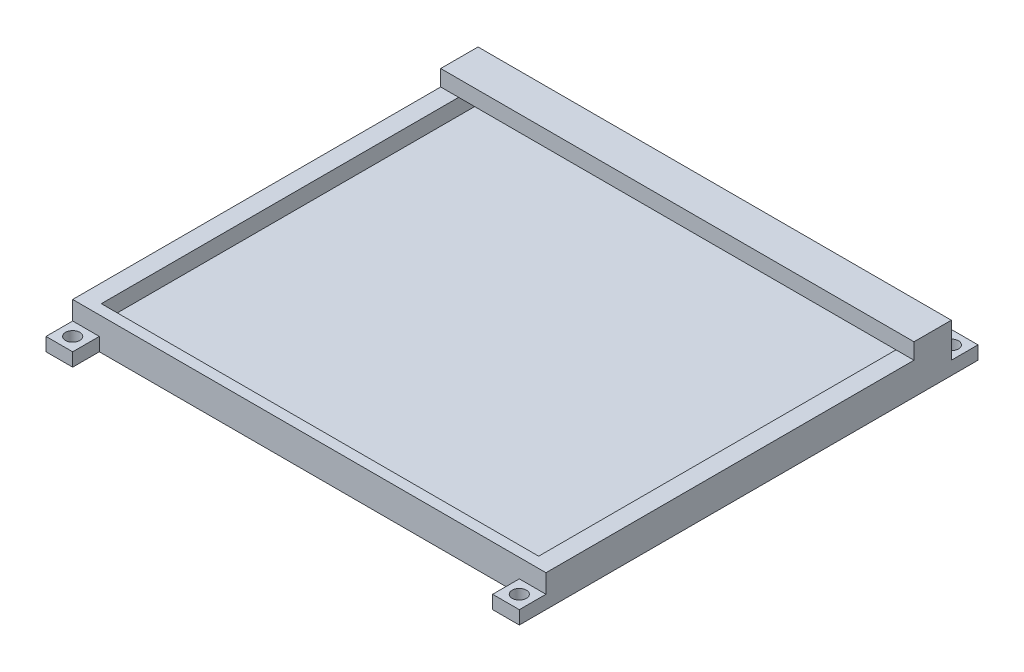
ISO-10303-21;
HEADER;
FILE_DESCRIPTION(('STEP AP214'),'2;1');
FILE_NAME('part.step','',(''),(''),'','','');
FILE_SCHEMA(('AUTOMOTIVE_DESIGN { 1 0 10303 214 1 1 1 1 }'));
ENDSEC;
DATA;
#1=APPLICATION_CONTEXT('core data for automotive mechanical design processes');
#2=APPLICATION_PROTOCOL_DEFINITION('international standard','automotive_design',2000,#1);
#3=PRODUCT_CONTEXT('',#1,'mechanical');
#4=PRODUCT('Part','Part','',(#3));
#5=PRODUCT_RELATED_PRODUCT_CATEGORY('part','',(#4));
#6=PRODUCT_DEFINITION_FORMATION('','',#4);
#7=PRODUCT_DEFINITION_CONTEXT('part definition',#1,'design');
#8=PRODUCT_DEFINITION('design','',#6,#7);
#9=PRODUCT_DEFINITION_SHAPE('','',#8);
#10=(LENGTH_UNIT() NAMED_UNIT(*) SI_UNIT(.MILLI.,.METRE.));
#11=(NAMED_UNIT(*) PLANE_ANGLE_UNIT() SI_UNIT($,.RADIAN.));
#12=(NAMED_UNIT(*) SI_UNIT($,.STERADIAN.) SOLID_ANGLE_UNIT());
#13=UNCERTAINTY_MEASURE_WITH_UNIT(LENGTH_MEASURE(1.E-05),#10,'distance_accuracy_value','');
#14=(GEOMETRIC_REPRESENTATION_CONTEXT(3) GLOBAL_UNCERTAINTY_ASSIGNED_CONTEXT((#13)) GLOBAL_UNIT_ASSIGNED_CONTEXT((#10,
#11,#12)) REPRESENTATION_CONTEXT('',''));
#15=CARTESIAN_POINT('',(0.,0.,0.));
#16=DIRECTION('',(0.,0.,1.));
#17=DIRECTION('',(1.,0.,0.));
#18=AXIS2_PLACEMENT_3D('',#15,#16,#17);
#19=CARTESIAN_POINT('',(0.,7.62,0.));
#20=DIRECTION('',(0.,-1.,0.));
#21=DIRECTION('',(0.,0.,-1.));
#22=AXIS2_PLACEMENT_3D('',#19,#20,#21);
#23=PLANE('',#22);
#24=DIRECTION('',(1.,0.,0.));
#25=VECTOR('',#24,1.);
#26=CARTESIAN_POINT('',(0.,7.62,-87.63));
#27=LINE('',#26,#25);
#28=CARTESIAN_POINT('',(0.,7.62,-87.63));
#29=VERTEX_POINT('',#28);
#30=CARTESIAN_POINT('',(4.279999949,7.62,-87.63));
#31=VERTEX_POINT('',#30);
#32=EDGE_CURVE('E51',#29,#31,#27,.T.);
#33=ORIENTED_EDGE('',*,*,#32,.F.);
#34=DIRECTION('',(0.,0.,1.));
#35=VECTOR('',#34,1.);
#36=CARTESIAN_POINT('',(0.,7.62,0.));
#37=LINE('',#36,#35);
#38=CARTESIAN_POINT('',(0.,7.62,0.));
#39=VERTEX_POINT('',#38);
#40=EDGE_CURVE('E218',#29,#39,#37,.T.);
#41=ORIENTED_EDGE('',*,*,#40,.T.);
#42=DIRECTION('',(1.,0.,0.));
#43=VECTOR('',#42,1.);
#44=CARTESIAN_POINT('',(0.,7.62,0.));
#45=LINE('',#44,#43);
#46=CARTESIAN_POINT('',(112.699999898,7.62,0.));
#47=VERTEX_POINT('',#46);
#48=EDGE_CURVE('E383',#39,#47,#45,.T.);
#49=ORIENTED_EDGE('',*,*,#48,.T.);
#50=DIRECTION('',(0.,0.,-1.));
#51=VECTOR('',#50,1.);
#52=CARTESIAN_POINT('',(112.699999898,7.62,0.));
#53=LINE('',#52,#51);
#54=CARTESIAN_POINT('',(112.699999898,7.62,-87.63));
#55=VERTEX_POINT('',#54);
#56=EDGE_CURVE('E386',#47,#55,#53,.T.);
#57=ORIENTED_EDGE('',*,*,#56,.T.);
#58=CARTESIAN_POINT('',(108.419999949,7.62,-87.63));
#59=VERTEX_POINT('',#58);
#60=EDGE_CURVE('E11',#59,#55,#27,.T.);
#61=ORIENTED_EDGE('',*,*,#60,.F.);
#62=DIRECTION('',(0.,0.,-1.));
#63=VECTOR('',#62,1.);
#64=CARTESIAN_POINT('',(108.419999949,7.62,-2.54000000000001));
#65=LINE('',#64,#63);
#66=CARTESIAN_POINT('',(108.419999949,7.62,-2.54000000000001));
#67=VERTEX_POINT('',#66);
#68=EDGE_CURVE('E368',#67,#59,#65,.T.);
#69=ORIENTED_EDGE('',*,*,#68,.F.);
#70=DIRECTION('',(1.,0.,0.));
#71=VECTOR('',#70,1.);
#72=CARTESIAN_POINT('',(4.279999949,7.62,-2.54000000000001));
#73=LINE('',#72,#71);
#74=CARTESIAN_POINT('',(4.279999949,7.62,-2.54000000000001));
#75=VERTEX_POINT('',#74);
#76=EDGE_CURVE('E364',#75,#67,#73,.T.);
#77=ORIENTED_EDGE('',*,*,#76,.F.);
#78=DIRECTION('',(0.,0.,1.));
#79=VECTOR('',#78,1.);
#80=CARTESIAN_POINT('',(4.279999949,7.62,-2.54000000000001));
#81=LINE('',#80,#79);
#82=EDGE_CURVE('E342',#31,#75,#81,.T.);
#83=ORIENTED_EDGE('',*,*,#82,.F.);
#84=EDGE_LOOP('',(#33,#41,#49,#57,#61,#69,#77,#83));
#85=FACE_BOUND('',#84,.T.);
#86=ADVANCED_FACE('F41',(#85),#23,.F.);
#87=CARTESIAN_POINT('',(0.,7.62,-96.52));
#88=DIRECTION('',(0.,0.,1.));
#89=DIRECTION('',(1.,0.,0.));
#90=AXIS2_PLACEMENT_3D('',#87,#88,#89);
#91=PLANE('',#90);
#92=DIRECTION('',(-1.,0.,0.));
#93=VECTOR('',#92,1.);
#94=CARTESIAN_POINT('',(112.699999898,3.175,-96.52));
#95=LINE('',#94,#93);
#96=CARTESIAN_POINT('',(112.699999898,3.175,-96.52));
#97=VERTEX_POINT('',#96);
#98=CARTESIAN_POINT('',(106.349999898,3.175,-96.52));
#99=VERTEX_POINT('',#98);
#100=EDGE_CURVE('E244',#97,#99,#95,.T.);
#101=ORIENTED_EDGE('',*,*,#100,.T.);
#102=DIRECTION('',(0.,-1.,0.));
#103=VECTOR('',#102,1.);
#104=CARTESIAN_POINT('',(106.349999898,3.175,-96.52));
#105=LINE('',#104,#103);
#106=CARTESIAN_POINT('',(106.349999898,0.,-96.52));
#107=VERTEX_POINT('',#106);
#108=EDGE_CURVE('E226',#99,#107,#105,.T.);
#109=ORIENTED_EDGE('',*,*,#108,.T.);
#110=DIRECTION('',(-1.,0.,0.));
#111=VECTOR('',#110,1.);
#112=CARTESIAN_POINT('',(0.,0.,-96.52));
#113=LINE('',#112,#111);
#114=CARTESIAN_POINT('',(6.35,0.,-96.52));
#115=VERTEX_POINT('',#114);
#116=EDGE_CURVE('E384',#107,#115,#113,.T.);
#117=ORIENTED_EDGE('',*,*,#116,.T.);
#118=DIRECTION('',(0.,-1.,0.));
#119=VECTOR('',#118,1.);
#120=CARTESIAN_POINT('',(6.35,3.175,-96.52));
#121=LINE('',#120,#119);
#122=CARTESIAN_POINT('',(6.35,3.175,-96.52));
#123=VERTEX_POINT('',#122);
#124=EDGE_CURVE('E251',#123,#115,#121,.T.);
#125=ORIENTED_EDGE('',*,*,#124,.F.);
#126=DIRECTION('',(-1.,0.,0.));
#127=VECTOR('',#126,1.);
#128=CARTESIAN_POINT('',(0.,3.175,-96.52));
#129=LINE('',#128,#127);
#130=CARTESIAN_POINT('',(0.,3.175,-96.52));
#131=VERTEX_POINT('',#130);
#132=EDGE_CURVE('E257',#123,#131,#129,.T.);
#133=ORIENTED_EDGE('',*,*,#132,.T.);
#134=DIRECTION('',(0.,-1.,0.));
#135=VECTOR('',#134,1.);
#136=CARTESIAN_POINT('',(0.,7.62,-96.52));
#137=LINE('',#136,#135);
#138=CARTESIAN_POINT('',(0.,11.43,-96.52));
#139=VERTEX_POINT('',#138);
#140=EDGE_CURVE('E388',#139,#131,#137,.T.);
#141=ORIENTED_EDGE('',*,*,#140,.F.);
#142=DIRECTION('',(-1.,0.,0.));
#143=VECTOR('',#142,1.);
#144=CARTESIAN_POINT('',(0.,11.43,-96.52));
#145=LINE('',#144,#143);
#146=CARTESIAN_POINT('',(112.699999898,11.43,-96.52));
#147=VERTEX_POINT('',#146);
#148=EDGE_CURVE('E213',#147,#139,#145,.T.);
#149=ORIENTED_EDGE('',*,*,#148,.F.);
#150=DIRECTION('',(0.,-1.,0.));
#151=VECTOR('',#150,1.);
#152=CARTESIAN_POINT('',(112.699999898,7.62,-96.52));
#153=LINE('',#152,#151);
#154=EDGE_CURVE('E396',#147,#97,#153,.T.);
#155=ORIENTED_EDGE('',*,*,#154,.T.);
#156=EDGE_LOOP('',(#101,#109,#117,#125,#133,#141,#149,#155));
#157=FACE_BOUND('',#156,.T.);
#158=ADVANCED_FACE('F442',(#157),#91,.F.);
#159=CARTESIAN_POINT('',(0.,7.62,0.));
#160=DIRECTION('',(0.,0.,-1.));
#161=DIRECTION('',(-1.,0.,0.));
#162=AXIS2_PLACEMENT_3D('',#159,#160,#161);
#163=PLANE('',#162);
#164=DIRECTION('',(1.,0.,0.));
#165=VECTOR('',#164,1.);
#166=CARTESIAN_POINT('',(0.,3.175,0.));
#167=LINE('',#166,#165);
#168=CARTESIAN_POINT('',(0.,3.175,0.));
#169=VERTEX_POINT('',#168);
#170=CARTESIAN_POINT('',(6.35,3.175,0.));
#171=VERTEX_POINT('',#170);
#172=EDGE_CURVE('E306',#169,#171,#167,.T.);
#173=ORIENTED_EDGE('',*,*,#172,.T.);
#174=DIRECTION('',(0.,-1.,0.));
#175=VECTOR('',#174,1.);
#176=CARTESIAN_POINT('',(6.35,3.175,0.));
#177=LINE('',#176,#175);
#178=CARTESIAN_POINT('',(6.35,0.,0.));
#179=VERTEX_POINT('',#178);
#180=EDGE_CURVE('E285',#171,#179,#177,.T.);
#181=ORIENTED_EDGE('',*,*,#180,.T.);
#182=DIRECTION('',(1.,0.,0.));
#183=VECTOR('',#182,1.);
#184=CARTESIAN_POINT('',(0.,0.,0.));
#185=LINE('',#184,#183);
#186=CARTESIAN_POINT('',(106.349999898,0.,0.));
#187=VERTEX_POINT('',#186);
#188=EDGE_CURVE('E390',#179,#187,#185,.T.);
#189=ORIENTED_EDGE('',*,*,#188,.T.);
#190=DIRECTION('',(0.,-1.,0.));
#191=VECTOR('',#190,1.);
#192=CARTESIAN_POINT('',(106.349999898,3.175,0.));
#193=LINE('',#192,#191);
#194=CARTESIAN_POINT('',(106.349999898,3.175,0.));
#195=VERTEX_POINT('',#194);
#196=EDGE_CURVE('E339',#195,#187,#193,.T.);
#197=ORIENTED_EDGE('',*,*,#196,.F.);
#198=DIRECTION('',(1.,0.,0.));
#199=VECTOR('',#198,1.);
#200=CARTESIAN_POINT('',(112.699999898,3.175,0.));
#201=LINE('',#200,#199);
#202=CARTESIAN_POINT('',(112.699999898,3.175,0.));
#203=VERTEX_POINT('',#202);
#204=EDGE_CURVE('E331',#195,#203,#201,.T.);
#205=ORIENTED_EDGE('',*,*,#204,.T.);
#206=DIRECTION('',(0.,-1.,0.));
#207=VECTOR('',#206,1.);
#208=CARTESIAN_POINT('',(112.699999898,7.62,0.));
#209=LINE('',#208,#207);
#210=EDGE_CURVE('E397',#47,#203,#209,.T.);
#211=ORIENTED_EDGE('',*,*,#210,.F.);
#212=ORIENTED_EDGE('',*,*,#48,.F.);
#213=DIRECTION('',(0.,-1.,0.));
#214=VECTOR('',#213,1.);
#215=CARTESIAN_POINT('',(0.,7.62,0.));
#216=LINE('',#215,#214);
#217=EDGE_CURVE('E45',#39,#169,#216,.T.);
#218=ORIENTED_EDGE('',*,*,#217,.T.);
#219=EDGE_LOOP('',(#173,#181,#189,#197,#205,#211,#212,#218));
#220=FACE_BOUND('',#219,.T.);
#221=ADVANCED_FACE('F405',(#220),#163,.F.);
#222=CARTESIAN_POINT('',(0.,7.62,0.));
#223=DIRECTION('',(1.,0.,0.));
#224=DIRECTION('',(0.,0.,-1.));
#225=AXIS2_PLACEMENT_3D('',#222,#223,#224);
#226=PLANE('',#225);
#227=DIRECTION('',(0.,0.,1.));
#228=VECTOR('',#227,1.);
#229=CARTESIAN_POINT('',(0.,0.,0.));
#230=LINE('',#229,#228);
#231=CARTESIAN_POINT('',(0.,0.,-102.87));
#232=VERTEX_POINT('',#231);
#233=CARTESIAN_POINT('',(0.,0.,6.35));
#234=VERTEX_POINT('',#233);
#235=EDGE_CURVE('E374',#232,#234,#230,.T.);
#236=ORIENTED_EDGE('',*,*,#235,.T.);
#237=DIRECTION('',(0.,-1.,0.));
#238=VECTOR('',#237,1.);
#239=CARTESIAN_POINT('',(0.,3.175,6.35));
#240=LINE('',#239,#238);
#241=CARTESIAN_POINT('',(0.,3.175,6.35));
#242=VERTEX_POINT('',#241);
#243=EDGE_CURVE('E282',#242,#234,#240,.T.);
#244=ORIENTED_EDGE('',*,*,#243,.F.);
#245=DIRECTION('',(0.,0.,-1.));
#246=VECTOR('',#245,1.);
#247=CARTESIAN_POINT('',(0.,3.175,0.));
#248=LINE('',#247,#246);
#249=EDGE_CURVE('E297',#242,#169,#248,.T.);
#250=ORIENTED_EDGE('',*,*,#249,.T.);
#251=ORIENTED_EDGE('',*,*,#217,.F.);
#252=ORIENTED_EDGE('',*,*,#40,.F.);
#253=DIRECTION('',(0.,-1.,0.));
#254=VECTOR('',#253,1.);
#255=CARTESIAN_POINT('',(0.,11.43,-87.63));
#256=LINE('',#255,#254);
#257=CARTESIAN_POINT('',(0.,11.43,-87.63));
#258=VERTEX_POINT('',#257);
#259=EDGE_CURVE('E200',#258,#29,#256,.T.);
#260=ORIENTED_EDGE('',*,*,#259,.F.);
#261=DIRECTION('',(0.,0.,1.));
#262=VECTOR('',#261,1.);
#263=CARTESIAN_POINT('',(0.,11.43,-96.52));
#264=LINE('',#263,#262);
#265=EDGE_CURVE('E207',#139,#258,#264,.T.);
#266=ORIENTED_EDGE('',*,*,#265,.F.);
#267=ORIENTED_EDGE('',*,*,#140,.T.);
#268=DIRECTION('',(0.,0.,-1.));
#269=VECTOR('',#268,1.);
#270=CARTESIAN_POINT('',(0.,3.175,-96.52));
#271=LINE('',#270,#269);
#272=CARTESIAN_POINT('',(0.,3.175,-102.87));
#273=VERTEX_POINT('',#272);
#274=EDGE_CURVE('E266',#131,#273,#271,.T.);
#275=ORIENTED_EDGE('',*,*,#274,.T.);
#276=DIRECTION('',(0.,-1.,0.));
#277=VECTOR('',#276,1.);
#278=CARTESIAN_POINT('',(0.,3.175,-102.87));
#279=LINE('',#278,#277);
#280=EDGE_CURVE('E254',#273,#232,#279,.T.);
#281=ORIENTED_EDGE('',*,*,#280,.T.);
#282=EDGE_LOOP('',(#236,#244,#250,#251,#252,#260,#266,#267,#275,#281));
#283=FACE_BOUND('',#282,.T.);
#284=ADVANCED_FACE('F43',(#283),#226,.F.);
#285=CARTESIAN_POINT('',(112.699999898,7.62,0.));
#286=DIRECTION('',(-1.,0.,0.));
#287=DIRECTION('',(0.,0.,1.));
#288=AXIS2_PLACEMENT_3D('',#285,#286,#287);
#289=PLANE('',#288);
#290=DIRECTION('',(0.,0.,-1.));
#291=VECTOR('',#290,1.);
#292=CARTESIAN_POINT('',(112.699999898,0.,0.));
#293=LINE('',#292,#291);
#294=CARTESIAN_POINT('',(112.699999898,0.,6.35));
#295=VERTEX_POINT('',#294);
#296=CARTESIAN_POINT('',(112.699999898,0.,-102.87));
#297=VERTEX_POINT('',#296);
#298=EDGE_CURVE('E392',#295,#297,#293,.T.);
#299=ORIENTED_EDGE('',*,*,#298,.T.);
#300=DIRECTION('',(0.,-1.,0.));
#301=VECTOR('',#300,1.);
#302=CARTESIAN_POINT('',(112.699999898,3.175,-102.87));
#303=LINE('',#302,#301);
#304=CARTESIAN_POINT('',(112.699999898,3.175,-102.87));
#305=VERTEX_POINT('',#304);
#306=EDGE_CURVE('E219',#305,#297,#303,.T.);
#307=ORIENTED_EDGE('',*,*,#306,.F.);
#308=DIRECTION('',(0.,0.,1.));
#309=VECTOR('',#308,1.);
#310=CARTESIAN_POINT('',(112.699999898,3.175,-96.52));
#311=LINE('',#310,#309);
#312=EDGE_CURVE('E235',#305,#97,#311,.T.);
#313=ORIENTED_EDGE('',*,*,#312,.T.);
#314=ORIENTED_EDGE('',*,*,#154,.F.);
#315=DIRECTION('',(0.,0.,-1.));
#316=VECTOR('',#315,1.);
#317=CARTESIAN_POINT('',(112.699999898,11.43,-96.52));
#318=LINE('',#317,#316);
#319=CARTESIAN_POINT('',(112.699999898,11.43,-87.63));
#320=VERTEX_POINT('',#319);
#321=EDGE_CURVE('E206',#320,#147,#318,.T.);
#322=ORIENTED_EDGE('',*,*,#321,.F.);
#323=DIRECTION('',(0.,-1.,0.));
#324=VECTOR('',#323,1.);
#325=CARTESIAN_POINT('',(112.699999898,11.43,-87.63));
#326=LINE('',#325,#324);
#327=EDGE_CURVE('E202',#320,#55,#326,.T.);
#328=ORIENTED_EDGE('',*,*,#327,.T.);
#329=ORIENTED_EDGE('',*,*,#56,.F.);
#330=ORIENTED_EDGE('',*,*,#210,.T.);
#331=DIRECTION('',(0.,0.,1.));
#332=VECTOR('',#331,1.);
#333=CARTESIAN_POINT('',(112.699999898,3.175,0.));
#334=LINE('',#333,#332);
#335=CARTESIAN_POINT('',(112.699999898,3.175,6.35));
#336=VERTEX_POINT('',#335);
#337=EDGE_CURVE('E322',#203,#336,#334,.T.);
#338=ORIENTED_EDGE('',*,*,#337,.T.);
#339=DIRECTION('',(0.,-1.,0.));
#340=VECTOR('',#339,1.);
#341=CARTESIAN_POINT('',(112.699999898,3.175,6.35));
#342=LINE('',#341,#340);
#343=EDGE_CURVE('E334',#336,#295,#342,.T.);
#344=ORIENTED_EDGE('',*,*,#343,.T.);
#345=EDGE_LOOP('',(#299,#307,#313,#314,#322,#328,#329,#330,#338,#344));
#346=FACE_BOUND('',#345,.T.);
#347=ADVANCED_FACE('F433',(#346),#289,.F.);
#348=CARTESIAN_POINT('',(0.,0.,0.));
#349=DIRECTION('',(0.,-1.,0.));
#350=DIRECTION('',(0.,0.,-1.));
#351=AXIS2_PLACEMENT_3D('',#348,#349,#350);
#352=PLANE('',#351);
#353=ORIENTED_EDGE('',*,*,#235,.F.);
#354=DIRECTION('',(1.,0.,0.));
#355=VECTOR('',#354,1.);
#356=CARTESIAN_POINT('',(0.,0.,-102.87));
#357=LINE('',#356,#355);
#358=CARTESIAN_POINT('',(6.35,0.,-102.87));
#359=VERTEX_POINT('',#358);
#360=EDGE_CURVE('E265',#232,#359,#357,.T.);
#361=ORIENTED_EDGE('',*,*,#360,.T.);
#362=DIRECTION('',(0.,0.,1.));
#363=VECTOR('',#362,1.);
#364=CARTESIAN_POINT('',(6.35,0.,-96.52));
#365=LINE('',#364,#363);
#366=EDGE_CURVE('E262',#359,#115,#365,.T.);
#367=ORIENTED_EDGE('',*,*,#366,.T.);
#368=ORIENTED_EDGE('',*,*,#116,.F.);
#369=DIRECTION('',(0.,0.,-1.));
#370=VECTOR('',#369,1.);
#371=CARTESIAN_POINT('',(106.349999898,0.,-96.52));
#372=LINE('',#371,#370);
#373=CARTESIAN_POINT('',(106.349999898,0.,-102.87));
#374=VERTEX_POINT('',#373);
#375=EDGE_CURVE('E234',#107,#374,#372,.T.);
#376=ORIENTED_EDGE('',*,*,#375,.T.);
#377=DIRECTION('',(1.,0.,0.));
#378=VECTOR('',#377,1.);
#379=CARTESIAN_POINT('',(112.699999898,0.,-102.87));
#380=LINE('',#379,#378);
#381=EDGE_CURVE('E231',#374,#297,#380,.T.);
#382=ORIENTED_EDGE('',*,*,#381,.T.);
#383=ORIENTED_EDGE('',*,*,#298,.F.);
#384=DIRECTION('',(-1.,0.,0.));
#385=VECTOR('',#384,1.);
#386=CARTESIAN_POINT('',(112.699999898,0.,6.35));
#387=LINE('',#386,#385);
#388=CARTESIAN_POINT('',(106.349999898,0.,6.35));
#389=VERTEX_POINT('',#388);
#390=EDGE_CURVE('E319',#295,#389,#387,.T.);
#391=ORIENTED_EDGE('',*,*,#390,.T.);
#392=DIRECTION('',(0.,0.,-1.));
#393=VECTOR('',#392,1.);
#394=CARTESIAN_POINT('',(106.349999898,0.,0.));
#395=LINE('',#394,#393);
#396=EDGE_CURVE('E326',#389,#187,#395,.T.);
#397=ORIENTED_EDGE('',*,*,#396,.T.);
#398=ORIENTED_EDGE('',*,*,#188,.F.);
#399=DIRECTION('',(0.,0.,1.));
#400=VECTOR('',#399,1.);
#401=CARTESIAN_POINT('',(6.35,0.,0.));
#402=LINE('',#401,#400);
#403=CARTESIAN_POINT('',(6.35,0.,6.35));
#404=VERTEX_POINT('',#403);
#405=EDGE_CURVE('E296',#179,#404,#402,.T.);
#406=ORIENTED_EDGE('',*,*,#405,.T.);
#407=DIRECTION('',(-1.,0.,0.));
#408=VECTOR('',#407,1.);
#409=CARTESIAN_POINT('',(0.,0.,6.35));
#410=LINE('',#409,#408);
#411=EDGE_CURVE('E293',#404,#234,#410,.T.);
#412=ORIENTED_EDGE('',*,*,#411,.T.);
#413=EDGE_LOOP('',(#353,#361,#367,#368,#376,#382,#383,#391,#397,#398,#406,#412));
#414=FACE_BOUND('',#413,.T.);
#415=CARTESIAN_POINT('',(109.524999898,0.,3.175));
#416=DIRECTION('',(0.,-1.,0.));
#417=DIRECTION('',(0.,0.,-1.));
#418=AXIS2_PLACEMENT_3D('',#415,#416,#417);
#419=CIRCLE('',#418,1.7);
#420=CARTESIAN_POINT('',(109.524999898,0.,1.475));
#421=VERTEX_POINT('',#420);
#422=EDGE_CURVE('E313',#421,#421,#419,.T.);
#423=ORIENTED_EDGE('',*,*,#422,.F.);
#424=EDGE_LOOP('',(#423));
#425=FACE_BOUND('',#424,.T.);
#426=CARTESIAN_POINT('',(3.175,0.,3.175));
#427=DIRECTION('',(0.,-1.,0.));
#428=DIRECTION('',(0.,0.,-1.));
#429=AXIS2_PLACEMENT_3D('',#426,#427,#428);
#430=CIRCLE('',#429,1.7);
#431=CARTESIAN_POINT('',(3.175,0.,1.475));
#432=VERTEX_POINT('',#431);
#433=EDGE_CURVE('E310',#432,#432,#430,.T.);
#434=ORIENTED_EDGE('',*,*,#433,.F.);
#435=EDGE_LOOP('',(#434));
#436=FACE_BOUND('',#435,.T.);
#437=CARTESIAN_POINT('',(3.175,0.,-99.695));
#438=DIRECTION('',(0.,-1.,0.));
#439=DIRECTION('',(0.,0.,-1.));
#440=AXIS2_PLACEMENT_3D('',#437,#438,#439);
#441=CIRCLE('',#440,1.7);
#442=CARTESIAN_POINT('',(3.175,0.,-101.395));
#443=VERTEX_POINT('',#442);
#444=EDGE_CURVE('E279',#443,#443,#441,.T.);
#445=ORIENTED_EDGE('',*,*,#444,.F.);
#446=EDGE_LOOP('',(#445));
#447=FACE_BOUND('',#446,.T.);
#448=CARTESIAN_POINT('',(109.524999898,0.,-99.695));
#449=DIRECTION('',(0.,-1.,0.));
#450=DIRECTION('',(0.,0.,-1.));
#451=AXIS2_PLACEMENT_3D('',#448,#449,#450);
#452=CIRCLE('',#451,1.7);
#453=CARTESIAN_POINT('',(109.524999898,0.,-101.395));
#454=VERTEX_POINT('',#453);
#455=EDGE_CURVE('E248',#454,#454,#452,.T.);
#456=ORIENTED_EDGE('',*,*,#455,.F.);
#457=EDGE_LOOP('',(#456));
#458=FACE_BOUND('',#457,.T.);
#459=ADVANCED_FACE('F416',(#414,#425,#436,#447,#458),#352,.T.);
#460=CARTESIAN_POINT('',(4.279999949,3.81,-2.54000000000001));
#461=DIRECTION('',(-1.,0.,0.));
#462=DIRECTION('',(0.,0.,1.));
#463=AXIS2_PLACEMENT_3D('',#460,#461,#462);
#464=PLANE('',#463);
#465=CARTESIAN_POINT('',(4.279999949,7.62,-93.98));
#466=VERTEX_POINT('',#465);
#467=EDGE_CURVE('E361',#466,#31,#81,.T.);
#468=ORIENTED_EDGE('',*,*,#467,.T.);
#469=ORIENTED_EDGE('',*,*,#82,.T.);
#470=DIRECTION('',(0.,1.,0.));
#471=VECTOR('',#470,1.);
#472=CARTESIAN_POINT('',(4.279999949,3.81,-2.54000000000001));
#473=LINE('',#472,#471);
#474=CARTESIAN_POINT('',(4.279999949,3.81,-2.54000000000001));
#475=VERTEX_POINT('',#474);
#476=EDGE_CURVE('E360',#475,#75,#473,.T.);
#477=ORIENTED_EDGE('',*,*,#476,.F.);
#478=DIRECTION('',(0.,0.,1.));
#479=VECTOR('',#478,1.);
#480=CARTESIAN_POINT('',(4.279999949,3.81,-2.54000000000001));
#481=LINE('',#480,#479);
#482=CARTESIAN_POINT('',(4.279999949,3.81,-93.98));
#483=VERTEX_POINT('',#482);
#484=EDGE_CURVE('E347',#483,#475,#481,.T.);
#485=ORIENTED_EDGE('',*,*,#484,.F.);
#486=DIRECTION('',(0.,1.,0.));
#487=VECTOR('',#486,1.);
#488=CARTESIAN_POINT('',(4.279999949,3.81,-93.98));
#489=LINE('',#488,#487);
#490=EDGE_CURVE('E372',#483,#466,#489,.T.);
#491=ORIENTED_EDGE('',*,*,#490,.T.);
#492=EDGE_LOOP('',(#468,#469,#477,#485,#491));
#493=FACE_BOUND('',#492,.T.);
#494=ADVANCED_FACE('F488',(#493),#464,.F.);
#495=CARTESIAN_POINT('',(4.279999949,3.81,-93.98));
#496=DIRECTION('',(0.,0.,-1.));
#497=DIRECTION('',(-1.,0.,0.));
#498=AXIS2_PLACEMENT_3D('',#495,#496,#497);
#499=PLANE('',#498);
#500=DIRECTION('',(-1.,0.,0.));
#501=VECTOR('',#500,1.);
#502=CARTESIAN_POINT('',(4.279999949,7.62,-93.98));
#503=LINE('',#502,#501);
#504=CARTESIAN_POINT('',(108.419999949,7.62,-93.98));
#505=VERTEX_POINT('',#504);
#506=EDGE_CURVE('E351',#505,#466,#503,.T.);
#507=ORIENTED_EDGE('',*,*,#506,.T.);
#508=ORIENTED_EDGE('',*,*,#490,.F.);
#509=DIRECTION('',(-1.,0.,0.));
#510=VECTOR('',#509,1.);
#511=CARTESIAN_POINT('',(4.279999949,3.81,-93.98));
#512=LINE('',#511,#510);
#513=CARTESIAN_POINT('',(108.419999949,3.81,-93.98));
#514=VERTEX_POINT('',#513);
#515=EDGE_CURVE('E357',#514,#483,#512,.T.);
#516=ORIENTED_EDGE('',*,*,#515,.F.);
#517=DIRECTION('',(0.,1.,0.));
#518=VECTOR('',#517,1.);
#519=CARTESIAN_POINT('',(108.419999949,3.81,-93.98));
#520=LINE('',#519,#518);
#521=EDGE_CURVE('E375',#514,#505,#520,.T.);
#522=ORIENTED_EDGE('',*,*,#521,.T.);
#523=EDGE_LOOP('',(#507,#508,#516,#522));
#524=FACE_BOUND('',#523,.T.);
#525=ADVANCED_FACE('F515',(#524),#499,.F.);
#526=CARTESIAN_POINT('',(108.419999949,3.81,-2.54000000000001));
#527=DIRECTION('',(1.,0.,0.));
#528=DIRECTION('',(0.,0.,-1.));
#529=AXIS2_PLACEMENT_3D('',#526,#527,#528);
#530=PLANE('',#529);
#531=ORIENTED_EDGE('',*,*,#68,.T.);
#532=EDGE_CURVE('E367',#59,#505,#65,.T.);
#533=ORIENTED_EDGE('',*,*,#532,.T.);
#534=ORIENTED_EDGE('',*,*,#521,.F.);
#535=DIRECTION('',(0.,0.,-1.));
#536=VECTOR('',#535,1.);
#537=CARTESIAN_POINT('',(108.419999949,3.81,-2.54000000000001));
#538=LINE('',#537,#536);
#539=CARTESIAN_POINT('',(108.419999949,3.81,-2.54000000000001));
#540=VERTEX_POINT('',#539);
#541=EDGE_CURVE('E354',#540,#514,#538,.T.);
#542=ORIENTED_EDGE('',*,*,#541,.F.);
#543=DIRECTION('',(0.,1.,0.));
#544=VECTOR('',#543,1.);
#545=CARTESIAN_POINT('',(108.419999949,3.81,-2.54000000000001));
#546=LINE('',#545,#544);
#547=EDGE_CURVE('E378',#540,#67,#546,.T.);
#548=ORIENTED_EDGE('',*,*,#547,.T.);
#549=EDGE_LOOP('',(#531,#533,#534,#542,#548));
#550=FACE_BOUND('',#549,.T.);
#551=ADVANCED_FACE('F524',(#550),#530,.F.);
#552=CARTESIAN_POINT('',(4.279999949,3.81,-2.54000000000001));
#553=DIRECTION('',(0.,0.,1.));
#554=DIRECTION('',(1.,0.,0.));
#555=AXIS2_PLACEMENT_3D('',#552,#553,#554);
#556=PLANE('',#555);
#557=ORIENTED_EDGE('',*,*,#76,.T.);
#558=ORIENTED_EDGE('',*,*,#547,.F.);
#559=DIRECTION('',(1.,0.,0.));
#560=VECTOR('',#559,1.);
#561=CARTESIAN_POINT('',(4.279999949,3.81,-2.54000000000001));
#562=LINE('',#561,#560);
#563=EDGE_CURVE('E350',#475,#540,#562,.T.);
#564=ORIENTED_EDGE('',*,*,#563,.F.);
#565=ORIENTED_EDGE('',*,*,#476,.T.);
#566=EDGE_LOOP('',(#557,#558,#564,#565));
#567=FACE_BOUND('',#566,.T.);
#568=ADVANCED_FACE('F533',(#567),#556,.F.);
#569=CARTESIAN_POINT('',(0.,3.81,0.));
#570=DIRECTION('',(0.,-1.,0.));
#571=DIRECTION('',(0.,0.,-1.));
#572=AXIS2_PLACEMENT_3D('',#569,#570,#571);
#573=PLANE('',#572);
#574=ORIENTED_EDGE('',*,*,#484,.T.);
#575=ORIENTED_EDGE('',*,*,#563,.T.);
#576=ORIENTED_EDGE('',*,*,#541,.T.);
#577=ORIENTED_EDGE('',*,*,#515,.T.);
#578=EDGE_LOOP('',(#574,#575,#576,#577));
#579=FACE_BOUND('',#578,.T.);
#580=ADVANCED_FACE('F678',(#579),#573,.F.);
#581=CARTESIAN_POINT('',(106.349999898,3.175,0.));
#582=DIRECTION('',(-1.,0.,0.));
#583=DIRECTION('',(0.,0.,1.));
#584=AXIS2_PLACEMENT_3D('',#581,#582,#583);
#585=PLANE('',#584);
#586=ORIENTED_EDGE('',*,*,#396,.F.);
#587=DIRECTION('',(0.,-1.,0.));
#588=VECTOR('',#587,1.);
#589=CARTESIAN_POINT('',(106.349999898,3.175,6.35));
#590=LINE('',#589,#588);
#591=CARTESIAN_POINT('',(106.349999898,3.175,6.35));
#592=VERTEX_POINT('',#591);
#593=EDGE_CURVE('E343',#592,#389,#590,.T.);
#594=ORIENTED_EDGE('',*,*,#593,.F.);
#595=DIRECTION('',(0.,0.,-1.));
#596=VECTOR('',#595,1.);
#597=CARTESIAN_POINT('',(106.349999898,3.175,0.));
#598=LINE('',#597,#596);
#599=EDGE_CURVE('E329',#592,#195,#598,.T.);
#600=ORIENTED_EDGE('',*,*,#599,.T.);
#601=ORIENTED_EDGE('',*,*,#196,.T.);
#602=EDGE_LOOP('',(#586,#594,#600,#601));
#603=FACE_BOUND('',#602,.T.);
#604=ADVANCED_FACE('F424',(#603),#585,.T.);
#605=CARTESIAN_POINT('',(112.699999898,3.175,6.35));
#606=DIRECTION('',(0.,0.,1.));
#607=DIRECTION('',(1.,0.,0.));
#608=AXIS2_PLACEMENT_3D('',#605,#606,#607);
#609=PLANE('',#608);
#610=ORIENTED_EDGE('',*,*,#390,.F.);
#611=ORIENTED_EDGE('',*,*,#343,.F.);
#612=DIRECTION('',(-1.,0.,0.));
#613=VECTOR('',#612,1.);
#614=CARTESIAN_POINT('',(112.699999898,3.175,6.35));
#615=LINE('',#614,#613);
#616=EDGE_CURVE('E325',#336,#592,#615,.T.);
#617=ORIENTED_EDGE('',*,*,#616,.T.);
#618=ORIENTED_EDGE('',*,*,#593,.T.);
#619=EDGE_LOOP('',(#610,#611,#617,#618));
#620=FACE_BOUND('',#619,.T.);
#621=ADVANCED_FACE('F429',(#620),#609,.T.);
#622=CARTESIAN_POINT('',(0.,3.175,0.));
#623=DIRECTION('',(0.,-1.,0.));
#624=DIRECTION('',(0.,0.,-1.));
#625=AXIS2_PLACEMENT_3D('',#622,#623,#624);
#626=PLANE('',#625);
#627=CARTESIAN_POINT('',(109.524999898,3.175,3.175));
#628=DIRECTION('',(0.,-1.,0.));
#629=DIRECTION('',(0.,0.,-1.));
#630=AXIS2_PLACEMENT_3D('',#627,#628,#629);
#631=CIRCLE('',#630,1.7);
#632=CARTESIAN_POINT('',(109.524999898,3.175,1.475));
#633=VERTEX_POINT('',#632);
#634=EDGE_CURVE('E316',#633,#633,#631,.T.);
#635=ORIENTED_EDGE('',*,*,#634,.T.);
#636=EDGE_LOOP('',(#635));
#637=FACE_BOUND('',#636,.T.);
#638=ORIENTED_EDGE('',*,*,#337,.F.);
#639=ORIENTED_EDGE('',*,*,#204,.F.);
#640=ORIENTED_EDGE('',*,*,#599,.F.);
#641=ORIENTED_EDGE('',*,*,#616,.F.);
#642=EDGE_LOOP('',(#638,#639,#640,#641));
#643=FACE_BOUND('',#642,.T.);
#644=ADVANCED_FACE('F432',(#637,#643),#626,.F.);
#645=CARTESIAN_POINT('',(109.524999898,3.175,3.175));
#646=DIRECTION('',(0.,-1.,0.));
#647=DIRECTION('',(0.,0.,-1.));
#648=AXIS2_PLACEMENT_3D('',#645,#646,#647);
#649=CYLINDRICAL_SURFACE('',#648,1.7);
#650=ORIENTED_EDGE('',*,*,#634,.F.);
#651=EDGE_LOOP('',(#650));
#652=FACE_BOUND('',#651,.T.);
#653=ORIENTED_EDGE('',*,*,#422,.T.);
#654=EDGE_LOOP('',(#653));
#655=FACE_BOUND('',#654,.T.);
#656=ADVANCED_FACE('F647',(#652,#655),#649,.F.);
#657=CARTESIAN_POINT('',(0.,3.175,6.35));
#658=DIRECTION('',(0.,0.,1.));
#659=DIRECTION('',(1.,0.,0.));
#660=AXIS2_PLACEMENT_3D('',#657,#658,#659);
#661=PLANE('',#660);
#662=ORIENTED_EDGE('',*,*,#411,.F.);
#663=DIRECTION('',(0.,-1.,0.));
#664=VECTOR('',#663,1.);
#665=CARTESIAN_POINT('',(6.35,3.175,6.35));
#666=LINE('',#665,#664);
#667=CARTESIAN_POINT('',(6.35,3.175,6.35));
#668=VERTEX_POINT('',#667);
#669=EDGE_CURVE('E289',#668,#404,#666,.T.);
#670=ORIENTED_EDGE('',*,*,#669,.F.);
#671=DIRECTION('',(-1.,0.,0.));
#672=VECTOR('',#671,1.);
#673=CARTESIAN_POINT('',(0.,3.175,6.35));
#674=LINE('',#673,#672);
#675=EDGE_CURVE('E288',#668,#242,#674,.T.);
#676=ORIENTED_EDGE('',*,*,#675,.T.);
#677=ORIENTED_EDGE('',*,*,#243,.T.);
#678=EDGE_LOOP('',(#662,#670,#676,#677));
#679=FACE_BOUND('',#678,.T.);
#680=ADVANCED_FACE('F414',(#679),#661,.T.);
#681=CARTESIAN_POINT('',(6.35,3.175,0.));
#682=DIRECTION('',(1.,0.,0.));
#683=DIRECTION('',(0.,0.,-1.));
#684=AXIS2_PLACEMENT_3D('',#681,#682,#683);
#685=PLANE('',#684);
#686=ORIENTED_EDGE('',*,*,#405,.F.);
#687=ORIENTED_EDGE('',*,*,#180,.F.);
#688=DIRECTION('',(0.,0.,1.));
#689=VECTOR('',#688,1.);
#690=CARTESIAN_POINT('',(6.35,3.175,0.));
#691=LINE('',#690,#689);
#692=EDGE_CURVE('E303',#171,#668,#691,.T.);
#693=ORIENTED_EDGE('',*,*,#692,.T.);
#694=ORIENTED_EDGE('',*,*,#669,.T.);
#695=EDGE_LOOP('',(#686,#687,#693,#694));
#696=FACE_BOUND('',#695,.T.);
#697=ADVANCED_FACE('F420',(#696),#685,.T.);
#698=CARTESIAN_POINT('',(0.,3.175,0.));
#699=DIRECTION('',(0.,1.,0.));
#700=DIRECTION('',(0.,0.,1.));
#701=AXIS2_PLACEMENT_3D('',#698,#699,#700);
#702=PLANE('',#701);
#703=CARTESIAN_POINT('',(3.175,3.175,3.175));
#704=DIRECTION('',(0.,-1.,0.));
#705=DIRECTION('',(0.,0.,-1.));
#706=AXIS2_PLACEMENT_3D('',#703,#704,#705);
#707=CIRCLE('',#706,1.7);
#708=CARTESIAN_POINT('',(3.175,3.175,1.475));
#709=VERTEX_POINT('',#708);
#710=EDGE_CURVE('E300',#709,#709,#707,.T.);
#711=ORIENTED_EDGE('',*,*,#710,.T.);
#712=EDGE_LOOP('',(#711));
#713=FACE_BOUND('',#712,.T.);
#714=ORIENTED_EDGE('',*,*,#249,.F.);
#715=ORIENTED_EDGE('',*,*,#675,.F.);
#716=ORIENTED_EDGE('',*,*,#692,.F.);
#717=ORIENTED_EDGE('',*,*,#172,.F.);
#718=EDGE_LOOP('',(#714,#715,#716,#717));
#719=FACE_BOUND('',#718,.T.);
#720=ADVANCED_FACE('F410',(#713,#719),#702,.T.);
#721=CARTESIAN_POINT('',(3.175,3.175,3.175));
#722=DIRECTION('',(0.,-1.,0.));
#723=DIRECTION('',(0.,0.,-1.));
#724=AXIS2_PLACEMENT_3D('',#721,#722,#723);
#725=CYLINDRICAL_SURFACE('',#724,1.7);
#726=ORIENTED_EDGE('',*,*,#710,.F.);
#727=EDGE_LOOP('',(#726));
#728=FACE_BOUND('',#727,.T.);
#729=ORIENTED_EDGE('',*,*,#433,.T.);
#730=EDGE_LOOP('',(#729));
#731=FACE_BOUND('',#730,.T.);
#732=ADVANCED_FACE('F616',(#728,#731),#725,.F.);
#733=CARTESIAN_POINT('',(6.35,3.175,-96.52));
#734=DIRECTION('',(1.,0.,0.));
#735=DIRECTION('',(0.,0.,-1.));
#736=AXIS2_PLACEMENT_3D('',#733,#734,#735);
#737=PLANE('',#736);
#738=ORIENTED_EDGE('',*,*,#366,.F.);
#739=DIRECTION('',(0.,-1.,0.));
#740=VECTOR('',#739,1.);
#741=CARTESIAN_POINT('',(6.35,3.175,-102.87));
#742=LINE('',#741,#740);
#743=CARTESIAN_POINT('',(6.35,3.175,-102.87));
#744=VERTEX_POINT('',#743);
#745=EDGE_CURVE('E258',#744,#359,#742,.T.);
#746=ORIENTED_EDGE('',*,*,#745,.F.);
#747=DIRECTION('',(0.,0.,1.));
#748=VECTOR('',#747,1.);
#749=CARTESIAN_POINT('',(6.35,3.175,-96.52));
#750=LINE('',#749,#748);
#751=EDGE_CURVE('E272',#744,#123,#750,.T.);
#752=ORIENTED_EDGE('',*,*,#751,.T.);
#753=ORIENTED_EDGE('',*,*,#124,.T.);
#754=EDGE_LOOP('',(#738,#746,#752,#753));
#755=FACE_BOUND('',#754,.T.);
#756=ADVANCED_FACE('F455',(#755),#737,.T.);
#757=CARTESIAN_POINT('',(0.,3.175,-102.87));
#758=DIRECTION('',(0.,0.,-1.));
#759=DIRECTION('',(-1.,0.,0.));
#760=AXIS2_PLACEMENT_3D('',#757,#758,#759);
#761=PLANE('',#760);
#762=ORIENTED_EDGE('',*,*,#360,.F.);
#763=ORIENTED_EDGE('',*,*,#280,.F.);
#764=DIRECTION('',(1.,0.,0.));
#765=VECTOR('',#764,1.);
#766=CARTESIAN_POINT('',(0.,3.175,-102.87));
#767=LINE('',#766,#765);
#768=EDGE_CURVE('E274',#273,#744,#767,.T.);
#769=ORIENTED_EDGE('',*,*,#768,.T.);
#770=ORIENTED_EDGE('',*,*,#745,.T.);
#771=EDGE_LOOP('',(#762,#763,#769,#770));
#772=FACE_BOUND('',#771,.T.);
#773=ADVANCED_FACE('F452',(#772),#761,.T.);
#774=CARTESIAN_POINT('',(0.,3.175,0.));
#775=DIRECTION('',(0.,-1.,0.));
#776=DIRECTION('',(0.,0.,-1.));
#777=AXIS2_PLACEMENT_3D('',#774,#775,#776);
#778=PLANE('',#777);
#779=CARTESIAN_POINT('',(3.175,3.175,-99.695));
#780=DIRECTION('',(0.,-1.,0.));
#781=DIRECTION('',(0.,0.,-1.));
#782=AXIS2_PLACEMENT_3D('',#779,#780,#781);
#783=CIRCLE('',#782,1.7);
#784=CARTESIAN_POINT('',(3.175,3.175,-101.395));
#785=VERTEX_POINT('',#784);
#786=EDGE_CURVE('E269',#785,#785,#783,.T.);
#787=ORIENTED_EDGE('',*,*,#786,.T.);
#788=EDGE_LOOP('',(#787));
#789=FACE_BOUND('',#788,.T.);
#790=ORIENTED_EDGE('',*,*,#274,.F.);
#791=ORIENTED_EDGE('',*,*,#132,.F.);
#792=ORIENTED_EDGE('',*,*,#751,.F.);
#793=ORIENTED_EDGE('',*,*,#768,.F.);
#794=EDGE_LOOP('',(#790,#791,#792,#793));
#795=FACE_BOUND('',#794,.T.);
#796=ADVANCED_FACE('F449',(#789,#795),#778,.F.);
#797=CARTESIAN_POINT('',(3.175,3.175,-99.695));
#798=DIRECTION('',(0.,-1.,0.));
#799=DIRECTION('',(0.,0.,-1.));
#800=AXIS2_PLACEMENT_3D('',#797,#798,#799);
#801=CYLINDRICAL_SURFACE('',#800,1.7);
#802=ORIENTED_EDGE('',*,*,#786,.F.);
#803=EDGE_LOOP('',(#802));
#804=FACE_BOUND('',#803,.T.);
#805=ORIENTED_EDGE('',*,*,#444,.T.);
#806=EDGE_LOOP('',(#805));
#807=FACE_BOUND('',#806,.T.);
#808=ADVANCED_FACE('F586',(#804,#807),#801,.F.);
#809=CARTESIAN_POINT('',(112.699999898,3.175,-102.87));
#810=DIRECTION('',(0.,0.,-1.));
#811=DIRECTION('',(-1.,0.,0.));
#812=AXIS2_PLACEMENT_3D('',#809,#810,#811);
#813=PLANE('',#812);
#814=ORIENTED_EDGE('',*,*,#381,.F.);
#815=DIRECTION('',(0.,-1.,0.));
#816=VECTOR('',#815,1.);
#817=CARTESIAN_POINT('',(106.349999898,3.175,-102.87));
#818=LINE('',#817,#816);
#819=CARTESIAN_POINT('',(106.349999898,3.175,-102.87));
#820=VERTEX_POINT('',#819);
#821=EDGE_CURVE('E222',#820,#374,#818,.T.);
#822=ORIENTED_EDGE('',*,*,#821,.F.);
#823=DIRECTION('',(1.,0.,0.));
#824=VECTOR('',#823,1.);
#825=CARTESIAN_POINT('',(112.699999898,3.175,-102.87));
#826=LINE('',#825,#824);
#827=EDGE_CURVE('E229',#820,#305,#826,.T.);
#828=ORIENTED_EDGE('',*,*,#827,.T.);
#829=ORIENTED_EDGE('',*,*,#306,.T.);
#830=EDGE_LOOP('',(#814,#822,#828,#829));
#831=FACE_BOUND('',#830,.T.);
#832=ADVANCED_FACE('F463',(#831),#813,.T.);
#833=CARTESIAN_POINT('',(106.349999898,3.175,-96.52));
#834=DIRECTION('',(-1.,0.,0.));
#835=DIRECTION('',(0.,0.,1.));
#836=AXIS2_PLACEMENT_3D('',#833,#834,#835);
#837=PLANE('',#836);
#838=ORIENTED_EDGE('',*,*,#375,.F.);
#839=ORIENTED_EDGE('',*,*,#108,.F.);
#840=DIRECTION('',(0.,0.,-1.));
#841=VECTOR('',#840,1.);
#842=CARTESIAN_POINT('',(106.349999898,3.175,-96.52));
#843=LINE('',#842,#841);
#844=EDGE_CURVE('E241',#99,#820,#843,.T.);
#845=ORIENTED_EDGE('',*,*,#844,.T.);
#846=ORIENTED_EDGE('',*,*,#821,.T.);
#847=EDGE_LOOP('',(#838,#839,#845,#846));
#848=FACE_BOUND('',#847,.T.);
#849=ADVANCED_FACE('F460',(#848),#837,.T.);
#850=CARTESIAN_POINT('',(0.,3.175,0.));
#851=DIRECTION('',(0.,1.,0.));
#852=DIRECTION('',(0.,0.,1.));
#853=AXIS2_PLACEMENT_3D('',#850,#851,#852);
#854=PLANE('',#853);
#855=CARTESIAN_POINT('',(109.524999898,3.175,-99.695));
#856=DIRECTION('',(0.,-1.,0.));
#857=DIRECTION('',(0.,0.,-1.));
#858=AXIS2_PLACEMENT_3D('',#855,#856,#857);
#859=CIRCLE('',#858,1.7);
#860=CARTESIAN_POINT('',(109.524999898,3.175,-101.395));
#861=VERTEX_POINT('',#860);
#862=EDGE_CURVE('E238',#861,#861,#859,.T.);
#863=ORIENTED_EDGE('',*,*,#862,.T.);
#864=EDGE_LOOP('',(#863));
#865=FACE_BOUND('',#864,.T.);
#866=ORIENTED_EDGE('',*,*,#312,.F.);
#867=ORIENTED_EDGE('',*,*,#827,.F.);
#868=ORIENTED_EDGE('',*,*,#844,.F.);
#869=ORIENTED_EDGE('',*,*,#100,.F.);
#870=EDGE_LOOP('',(#866,#867,#868,#869));
#871=FACE_BOUND('',#870,.T.);
#872=ADVANCED_FACE('F467',(#865,#871),#854,.T.);
#873=CARTESIAN_POINT('',(109.524999898,3.175,-99.695));
#874=DIRECTION('',(0.,-1.,0.));
#875=DIRECTION('',(0.,0.,-1.));
#876=AXIS2_PLACEMENT_3D('',#873,#874,#875);
#877=CYLINDRICAL_SURFACE('',#876,1.7);
#878=ORIENTED_EDGE('',*,*,#862,.F.);
#879=EDGE_LOOP('',(#878));
#880=FACE_BOUND('',#879,.T.);
#881=ORIENTED_EDGE('',*,*,#455,.T.);
#882=EDGE_LOOP('',(#881));
#883=FACE_BOUND('',#882,.T.);
#884=ADVANCED_FACE('F469',(#880,#883),#877,.F.);
#885=CARTESIAN_POINT('',(0.,11.43,-87.63));
#886=DIRECTION('',(0.,0.,-1.));
#887=DIRECTION('',(-1.,0.,0.));
#888=AXIS2_PLACEMENT_3D('',#885,#886,#887);
#889=PLANE('',#888);
#890=ORIENTED_EDGE('',*,*,#32,.T.);
#891=EDGE_CURVE('E52',#31,#59,#27,.T.);
#892=ORIENTED_EDGE('',*,*,#891,.T.);
#893=ORIENTED_EDGE('',*,*,#60,.T.);
#894=ORIENTED_EDGE('',*,*,#327,.F.);
#895=DIRECTION('',(1.,0.,0.));
#896=VECTOR('',#895,1.);
#897=CARTESIAN_POINT('',(0.,11.43,-87.63));
#898=LINE('',#897,#896);
#899=EDGE_CURVE('E196',#258,#320,#898,.T.);
#900=ORIENTED_EDGE('',*,*,#899,.F.);
#901=ORIENTED_EDGE('',*,*,#259,.T.);
#902=EDGE_LOOP('',(#890,#892,#893,#894,#900,#901));
#903=FACE_BOUND('',#902,.T.);
#904=ADVANCED_FACE('F198',(#903),#889,.F.);
#905=CARTESIAN_POINT('',(0.,11.43,0.));
#906=DIRECTION('',(0.,1.,0.));
#907=DIRECTION('',(0.,0.,1.));
#908=AXIS2_PLACEMENT_3D('',#905,#906,#907);
#909=PLANE('',#908);
#910=ORIENTED_EDGE('',*,*,#265,.T.);
#911=ORIENTED_EDGE('',*,*,#899,.T.);
#912=ORIENTED_EDGE('',*,*,#321,.T.);
#913=ORIENTED_EDGE('',*,*,#148,.T.);
#914=EDGE_LOOP('',(#910,#911,#912,#913));
#915=FACE_BOUND('',#914,.T.);
#916=ADVANCED_FACE('F211',(#915),#909,.T.);
#917=CARTESIAN_POINT('',(0.,7.62,0.));
#918=DIRECTION('',(0.,1.,0.));
#919=DIRECTION('',(0.,0.,1.));
#920=AXIS2_PLACEMENT_3D('',#917,#918,#919);
#921=PLANE('',#920);
#922=ORIENTED_EDGE('',*,*,#467,.F.);
#923=ORIENTED_EDGE('',*,*,#506,.F.);
#924=ORIENTED_EDGE('',*,*,#532,.F.);
#925=ORIENTED_EDGE('',*,*,#891,.F.);
#926=EDGE_LOOP('',(#922,#923,#924,#925));
#927=FACE_BOUND('',#926,.T.);
#928=ADVANCED_FACE('F549',(#927),#921,.F.);
#929=CLOSED_SHELL('',(#86,#158,#221,#284,#347,#459,#494,#525,#551,#568,#580,#604,#621,#644,#656,
#680,#697,#720,#732,#756,#773,#796,#808,#832,#849,#872,#884,#904,#916,#928));
#930=MANIFOLD_SOLID_BREP('B2',#929);
#931=ADVANCED_BREP_SHAPE_REPRESENTATION('',(#18,#930),#14);
#932=SHAPE_DEFINITION_REPRESENTATION(#9,#931);
ENDSEC;
END-ISO-10303-21;
